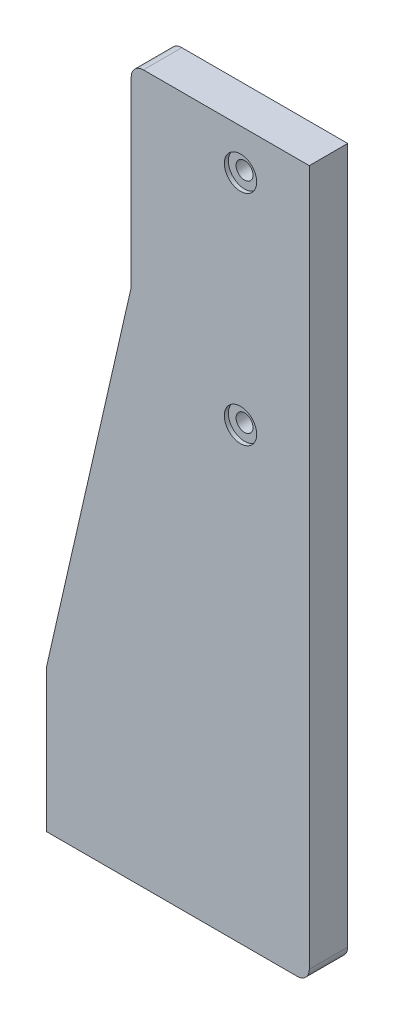
ISO-10303-21;
HEADER;
FILE_DESCRIPTION(('STEP AP214'),'2;1');
FILE_NAME('part.step','',(''),(''),'','','');
FILE_SCHEMA(('AUTOMOTIVE_DESIGN { 1 0 10303 214 1 1 1 1 }'));
ENDSEC;
DATA;
#1=APPLICATION_CONTEXT('core data for automotive mechanical design processes');
#2=APPLICATION_PROTOCOL_DEFINITION('international standard','automotive_design',2000,#1);
#3=PRODUCT_CONTEXT('',#1,'mechanical');
#4=PRODUCT('Part','Part','',(#3));
#5=PRODUCT_RELATED_PRODUCT_CATEGORY('part','',(#4));
#6=PRODUCT_DEFINITION_FORMATION('','',#4);
#7=PRODUCT_DEFINITION_CONTEXT('part definition',#1,'design');
#8=PRODUCT_DEFINITION('design','',#6,#7);
#9=PRODUCT_DEFINITION_SHAPE('','',#8);
#10=(LENGTH_UNIT() NAMED_UNIT(*) SI_UNIT(.MILLI.,.METRE.));
#11=(NAMED_UNIT(*) PLANE_ANGLE_UNIT() SI_UNIT($,.RADIAN.));
#12=(NAMED_UNIT(*) SI_UNIT($,.STERADIAN.) SOLID_ANGLE_UNIT());
#13=UNCERTAINTY_MEASURE_WITH_UNIT(LENGTH_MEASURE(1.E-05),#10,'distance_accuracy_value','');
#14=(GEOMETRIC_REPRESENTATION_CONTEXT(3) GLOBAL_UNCERTAINTY_ASSIGNED_CONTEXT((#13)) GLOBAL_UNIT_ASSIGNED_CONTEXT((#10,
#11,#12)) REPRESENTATION_CONTEXT('',''));
#15=CARTESIAN_POINT('',(0.,0.,0.));
#16=DIRECTION('',(0.,0.,1.));
#17=DIRECTION('',(1.,0.,0.));
#18=AXIS2_PLACEMENT_3D('',#15,#16,#17);
#19=CARTESIAN_POINT('',(48.,111.,0.));
#20=DIRECTION('',(0.,0.,1.));
#21=DIRECTION('',(1.,0.,0.));
#22=AXIS2_PLACEMENT_3D('',#19,#20,#21);
#23=CYLINDRICAL_SURFACE('',#22,2.1);
#24=CARTESIAN_POINT('',(48.,111.,0.));
#25=DIRECTION('',(0.,0.,1.));
#26=DIRECTION('',(1.,0.,0.));
#27=AXIS2_PLACEMENT_3D('',#24,#25,#26);
#28=CIRCLE('',#27,2.1);
#29=CARTESIAN_POINT('',(50.1,111.,0.));
#30=VERTEX_POINT('',#29);
#31=EDGE_CURVE('E142',#30,#30,#28,.T.);
#32=ORIENTED_EDGE('',*,*,#31,.F.);
#33=EDGE_LOOP('',(#32));
#34=FACE_BOUND('',#33,.T.);
#35=CARTESIAN_POINT('',(48.,111.,8.5));
#36=DIRECTION('',(0.,0.,1.));
#37=DIRECTION('',(1.,0.,0.));
#38=AXIS2_PLACEMENT_3D('',#35,#36,#37);
#39=CIRCLE('',#38,2.1);
#40=CARTESIAN_POINT('',(50.1,111.,8.5));
#41=VERTEX_POINT('',#40);
#42=EDGE_CURVE('E161',#41,#41,#39,.F.);
#43=ORIENTED_EDGE('',*,*,#42,.F.);
#44=EDGE_LOOP('',(#43));
#45=FACE_BOUND('',#44,.T.);
#46=ADVANCED_FACE('F35',(#34,#45),#23,.F.);
#47=CARTESIAN_POINT('',(48.,165.,0.));
#48=DIRECTION('',(0.,0.,1.));
#49=DIRECTION('',(1.,0.,0.));
#50=AXIS2_PLACEMENT_3D('',#47,#48,#49);
#51=CYLINDRICAL_SURFACE('',#50,2.1);
#52=CARTESIAN_POINT('',(48.,165.,0.));
#53=DIRECTION('',(0.,0.,1.));
#54=DIRECTION('',(1.,0.,0.));
#55=AXIS2_PLACEMENT_3D('',#52,#53,#54);
#56=CIRCLE('',#55,2.1);
#57=CARTESIAN_POINT('',(50.1,165.,0.));
#58=VERTEX_POINT('',#57);
#59=EDGE_CURVE('E159',#58,#58,#56,.T.);
#60=ORIENTED_EDGE('',*,*,#59,.F.);
#61=EDGE_LOOP('',(#60));
#62=FACE_BOUND('',#61,.T.);
#63=CARTESIAN_POINT('',(48.,165.,8.5));
#64=DIRECTION('',(0.,0.,1.));
#65=DIRECTION('',(1.,0.,0.));
#66=AXIS2_PLACEMENT_3D('',#63,#64,#65);
#67=CIRCLE('',#66,2.1);
#68=CARTESIAN_POINT('',(50.1,165.,8.5));
#69=VERTEX_POINT('',#68);
#70=EDGE_CURVE('E156',#69,#69,#67,.F.);
#71=ORIENTED_EDGE('',*,*,#70,.F.);
#72=EDGE_LOOP('',(#71));
#73=FACE_BOUND('',#72,.T.);
#74=ADVANCED_FACE('F207',(#62,#73),#51,.F.);
#75=CARTESIAN_POINT('',(21.,175.,9.5));
#76=DIRECTION('',(1.,0.,0.));
#77=DIRECTION('',(0.,1.,0.));
#78=AXIS2_PLACEMENT_3D('',#75,#76,#77);
#79=PLANE('',#78);
#80=DIRECTION('',(0.,-1.,0.));
#81=VECTOR('',#80,1.);
#82=CARTESIAN_POINT('',(21.,175.,0.));
#83=LINE('',#82,#81);
#84=CARTESIAN_POINT('',(21.,172.,0.));
#85=VERTEX_POINT('',#84);
#86=CARTESIAN_POINT('',(21.,127.338043935244,0.));
#87=VERTEX_POINT('',#86);
#88=EDGE_CURVE('E139',#85,#87,#83,.T.);
#89=ORIENTED_EDGE('',*,*,#88,.T.);
#90=DIRECTION('',(0.,0.,-1.));
#91=VECTOR('',#90,1.);
#92=CARTESIAN_POINT('',(21.,127.338043935244,9.5));
#93=LINE('',#92,#91);
#94=CARTESIAN_POINT('',(21.,127.338043935244,9.5));
#95=VERTEX_POINT('',#94);
#96=EDGE_CURVE('E183',#87,#95,#93,.F.);
#97=ORIENTED_EDGE('',*,*,#96,.T.);
#98=DIRECTION('',(0.,-1.,0.));
#99=VECTOR('',#98,1.);
#100=CARTESIAN_POINT('',(21.,175.,9.5));
#101=LINE('',#100,#99);
#102=CARTESIAN_POINT('',(21.,172.,9.5));
#103=VERTEX_POINT('',#102);
#104=EDGE_CURVE('E114',#103,#95,#101,.T.);
#105=ORIENTED_EDGE('',*,*,#104,.F.);
#106=DIRECTION('',(0.,0.,-1.));
#107=VECTOR('',#106,1.);
#108=CARTESIAN_POINT('',(21.,172.,9.5));
#109=LINE('',#108,#107);
#110=EDGE_CURVE('E180',#103,#85,#109,.T.);
#111=ORIENTED_EDGE('',*,*,#110,.T.);
#112=EDGE_LOOP('',(#89,#97,#105,#111));
#113=FACE_BOUND('',#112,.T.);
#114=ADVANCED_FACE('F192',(#113),#79,.F.);
#115=CARTESIAN_POINT('',(21.,127.,9.5));
#116=DIRECTION('',(0.974924232936237,-0.222537053170228,0.));
#117=DIRECTION('',(0.222537053170228,0.974924232936238,0.));
#118=AXIS2_PLACEMENT_3D('',#115,#116,#117);
#119=PLANE('',#118);
#120=DIRECTION('',(-0.222537053170228,-0.974924232936238,0.));
#121=VECTOR('',#120,1.);
#122=CARTESIAN_POINT('',(21.,127.,9.5));
#123=LINE('',#122,#121);
#124=CARTESIAN_POINT('',(20.9247726988087,126.670432775733,9.5));
#125=VERTEX_POINT('',#124);
#126=CARTESIAN_POINT('',(0.,35.,9.5));
#127=VERTEX_POINT('',#126);
#128=EDGE_CURVE('E104',#125,#127,#123,.T.);
#129=ORIENTED_EDGE('',*,*,#128,.F.);
#130=DIRECTION('',(0.,0.,-1.));
#131=VECTOR('',#130,1.);
#132=CARTESIAN_POINT('',(20.9247726988087,126.670432775733,0.));
#133=LINE('',#132,#131);
#134=CARTESIAN_POINT('',(20.9247726988087,126.670432775733,0.));
#135=VERTEX_POINT('',#134);
#136=EDGE_CURVE('E178',#125,#135,#133,.T.);
#137=ORIENTED_EDGE('',*,*,#136,.T.);
#138=DIRECTION('',(-0.222537053170228,-0.974924232936238,0.));
#139=VECTOR('',#138,1.);
#140=CARTESIAN_POINT('',(21.,127.,0.));
#141=LINE('',#140,#139);
#142=CARTESIAN_POINT('',(0.,35.,0.));
#143=VERTEX_POINT('',#142);
#144=EDGE_CURVE('E120',#135,#143,#141,.T.);
#145=ORIENTED_EDGE('',*,*,#144,.T.);
#146=DIRECTION('',(0.,0.,-1.));
#147=VECTOR('',#146,1.);
#148=CARTESIAN_POINT('',(0.,35.,9.5));
#149=LINE('',#148,#147);
#150=EDGE_CURVE('E117',#127,#143,#149,.T.);
#151=ORIENTED_EDGE('',*,*,#150,.F.);
#152=EDGE_LOOP('',(#129,#137,#145,#151));
#153=FACE_BOUND('',#152,.T.);
#154=ADVANCED_FACE('F118',(#153),#119,.F.);
#155=CARTESIAN_POINT('',(0.,35.,9.5));
#156=DIRECTION('',(1.,0.,0.));
#157=DIRECTION('',(0.,1.,0.));
#158=AXIS2_PLACEMENT_3D('',#155,#156,#157);
#159=PLANE('',#158);
#160=DIRECTION('',(0.,-1.,0.));
#161=VECTOR('',#160,1.);
#162=CARTESIAN_POINT('',(0.,35.,0.));
#163=LINE('',#162,#161);
#164=CARTESIAN_POINT('',(0.,0.,0.));
#165=VERTEX_POINT('',#164);
#166=EDGE_CURVE('E144',#143,#165,#163,.T.);
#167=ORIENTED_EDGE('',*,*,#166,.T.);
#168=DIRECTION('',(0.,0.,-1.));
#169=VECTOR('',#168,1.);
#170=CARTESIAN_POINT('',(0.,0.,9.5));
#171=LINE('',#170,#169);
#172=CARTESIAN_POINT('',(0.,0.,9.5));
#173=VERTEX_POINT('',#172);
#174=EDGE_CURVE('E124',#173,#165,#171,.T.);
#175=ORIENTED_EDGE('',*,*,#174,.F.);
#176=DIRECTION('',(0.,-1.,0.));
#177=VECTOR('',#176,1.);
#178=CARTESIAN_POINT('',(0.,35.,9.5));
#179=LINE('',#178,#177);
#180=EDGE_CURVE('E109',#127,#173,#179,.T.);
#181=ORIENTED_EDGE('',*,*,#180,.F.);
#182=ORIENTED_EDGE('',*,*,#150,.T.);
#183=EDGE_LOOP('',(#167,#175,#181,#182));
#184=FACE_BOUND('',#183,.T.);
#185=ADVANCED_FACE('F126',(#184),#159,.F.);
#186=CARTESIAN_POINT('',(0.,0.,9.5));
#187=DIRECTION('',(0.,1.,0.));
#188=DIRECTION('',(0.,0.,1.));
#189=AXIS2_PLACEMENT_3D('',#186,#187,#188);
#190=PLANE('',#189);
#191=DIRECTION('',(1.,0.,0.));
#192=VECTOR('',#191,1.);
#193=CARTESIAN_POINT('',(0.,0.,0.));
#194=LINE('',#193,#192);
#195=CARTESIAN_POINT('',(62.,0.,0.));
#196=VERTEX_POINT('',#195);
#197=EDGE_CURVE('E146',#165,#196,#194,.T.);
#198=ORIENTED_EDGE('',*,*,#197,.T.);
#199=DIRECTION('',(0.,0.,-1.));
#200=VECTOR('',#199,1.);
#201=CARTESIAN_POINT('',(62.,0.,9.5));
#202=LINE('',#201,#200);
#203=CARTESIAN_POINT('',(62.,0.,9.5));
#204=VERTEX_POINT('',#203);
#205=EDGE_CURVE('E172',#196,#204,#202,.F.);
#206=ORIENTED_EDGE('',*,*,#205,.T.);
#207=DIRECTION('',(1.,0.,0.));
#208=VECTOR('',#207,1.);
#209=CARTESIAN_POINT('',(0.,0.,9.5));
#210=LINE('',#209,#208);
#211=EDGE_CURVE('E129',#173,#204,#210,.T.);
#212=ORIENTED_EDGE('',*,*,#211,.F.);
#213=ORIENTED_EDGE('',*,*,#174,.T.);
#214=EDGE_LOOP('',(#198,#206,#212,#213));
#215=FACE_BOUND('',#214,.T.);
#216=ADVANCED_FACE('F232',(#215),#190,.F.);
#217=CARTESIAN_POINT('',(65.,0.,9.5));
#218=DIRECTION('',(-1.,0.,0.));
#219=DIRECTION('',(0.,0.,1.));
#220=AXIS2_PLACEMENT_3D('',#217,#218,#219);
#221=PLANE('',#220);
#222=DIRECTION('',(0.,1.,0.));
#223=VECTOR('',#222,1.);
#224=CARTESIAN_POINT('',(65.,0.,9.5));
#225=LINE('',#224,#223);
#226=CARTESIAN_POINT('',(65.,3.,9.5));
#227=VERTEX_POINT('',#226);
#228=CARTESIAN_POINT('',(65.,175.,9.5));
#229=VERTEX_POINT('',#228);
#230=EDGE_CURVE('E131',#227,#229,#225,.T.);
#231=ORIENTED_EDGE('',*,*,#230,.F.);
#232=DIRECTION('',(0.,0.,-1.));
#233=VECTOR('',#232,1.);
#234=CARTESIAN_POINT('',(65.,3.,9.5));
#235=LINE('',#234,#233);
#236=CARTESIAN_POINT('',(65.,3.,0.));
#237=VERTEX_POINT('',#236);
#238=EDGE_CURVE('E123',#227,#237,#235,.T.);
#239=ORIENTED_EDGE('',*,*,#238,.T.);
#240=DIRECTION('',(0.,1.,0.));
#241=VECTOR('',#240,1.);
#242=CARTESIAN_POINT('',(65.,0.,0.));
#243=LINE('',#242,#241);
#244=CARTESIAN_POINT('',(65.,175.,0.));
#245=VERTEX_POINT('',#244);
#246=EDGE_CURVE('E149',#237,#245,#243,.T.);
#247=ORIENTED_EDGE('',*,*,#246,.T.);
#248=DIRECTION('',(0.,0.,-1.));
#249=VECTOR('',#248,1.);
#250=CARTESIAN_POINT('',(65.,175.,9.5));
#251=LINE('',#250,#249);
#252=EDGE_CURVE('E138',#229,#245,#251,.T.);
#253=ORIENTED_EDGE('',*,*,#252,.F.);
#254=EDGE_LOOP('',(#231,#239,#247,#253));
#255=FACE_BOUND('',#254,.T.);
#256=ADVANCED_FACE('F229',(#255),#221,.F.);
#257=CARTESIAN_POINT('',(65.,175.,9.5));
#258=DIRECTION('',(0.,-1.,0.));
#259=DIRECTION('',(0.,0.,-1.));
#260=AXIS2_PLACEMENT_3D('',#257,#258,#259);
#261=PLANE('',#260);
#262=DIRECTION('',(-1.,0.,0.));
#263=VECTOR('',#262,1.);
#264=CARTESIAN_POINT('',(65.,175.,0.));
#265=LINE('',#264,#263);
#266=CARTESIAN_POINT('',(24.,175.,0.));
#267=VERTEX_POINT('',#266);
#268=EDGE_CURVE('E151',#245,#267,#265,.T.);
#269=ORIENTED_EDGE('',*,*,#268,.T.);
#270=DIRECTION('',(0.,0.,-1.));
#271=VECTOR('',#270,1.);
#272=CARTESIAN_POINT('',(24.,175.,9.5));
#273=LINE('',#272,#271);
#274=CARTESIAN_POINT('',(24.,175.,9.5));
#275=VERTEX_POINT('',#274);
#276=EDGE_CURVE('E50',#267,#275,#273,.F.);
#277=ORIENTED_EDGE('',*,*,#276,.T.);
#278=DIRECTION('',(-1.,0.,0.));
#279=VECTOR('',#278,1.);
#280=CARTESIAN_POINT('',(65.,175.,9.5));
#281=LINE('',#280,#279);
#282=EDGE_CURVE('E136',#229,#275,#281,.T.);
#283=ORIENTED_EDGE('',*,*,#282,.F.);
#284=ORIENTED_EDGE('',*,*,#252,.T.);
#285=EDGE_LOOP('',(#269,#277,#283,#284));
#286=FACE_BOUND('',#285,.T.);
#287=ADVANCED_FACE('F221',(#286),#261,.F.);
#288=CARTESIAN_POINT('',(0.,0.,9.5));
#289=DIRECTION('',(0.,0.,1.));
#290=DIRECTION('',(1.,0.,0.));
#291=AXIS2_PLACEMENT_3D('',#288,#289,#290);
#292=PLANE('',#291);
#293=CARTESIAN_POINT('',(48.,111.,9.5));
#294=DIRECTION('',(0.,0.,1.));
#295=DIRECTION('',(1.,0.,0.));
#296=AXIS2_PLACEMENT_3D('',#293,#294,#295);
#297=CIRCLE('',#296,4.00000000000001);
#298=CARTESIAN_POINT('',(52.,111.,9.5));
#299=VERTEX_POINT('',#298);
#300=EDGE_CURVE('E358',#299,#299,#297,.T.);
#301=ORIENTED_EDGE('',*,*,#300,.F.);
#302=EDGE_LOOP('',(#301));
#303=FACE_BOUND('',#302,.T.);
#304=CARTESIAN_POINT('',(48.,165.,9.5));
#305=DIRECTION('',(0.,0.,1.));
#306=DIRECTION('',(1.,0.,0.));
#307=AXIS2_PLACEMENT_3D('',#304,#305,#306);
#308=CIRCLE('',#307,4.00000000000001);
#309=CARTESIAN_POINT('',(52.,165.,9.5));
#310=VERTEX_POINT('',#309);
#311=EDGE_CURVE('E164',#310,#310,#308,.T.);
#312=ORIENTED_EDGE('',*,*,#311,.F.);
#313=EDGE_LOOP('',(#312));
#314=FACE_BOUND('',#313,.T.);
#315=ORIENTED_EDGE('',*,*,#211,.T.);
#316=CARTESIAN_POINT('',(62.,3.,9.5));
#317=DIRECTION('',(0.,0.,1.));
#318=DIRECTION('',(1.,0.,0.));
#319=AXIS2_PLACEMENT_3D('',#316,#317,#318);
#320=CIRCLE('',#319,3.);
#321=EDGE_CURVE('E176',#204,#227,#320,.T.);
#322=ORIENTED_EDGE('',*,*,#321,.T.);
#323=ORIENTED_EDGE('',*,*,#230,.T.);
#324=ORIENTED_EDGE('',*,*,#282,.T.);
#325=CARTESIAN_POINT('',(24.,172.,9.5));
#326=DIRECTION('',(0.,0.,1.));
#327=DIRECTION('',(1.,0.,0.));
#328=AXIS2_PLACEMENT_3D('',#325,#326,#327);
#329=CIRCLE('',#328,3.);
#330=EDGE_CURVE('E174',#275,#103,#329,.T.);
#331=ORIENTED_EDGE('',*,*,#330,.T.);
#332=ORIENTED_EDGE('',*,*,#104,.T.);
#333=CARTESIAN_POINT('',(18.,127.338043935244,9.5));
#334=DIRECTION('',(0.,0.,1.));
#335=DIRECTION('',(1.,0.,0.));
#336=AXIS2_PLACEMENT_3D('',#333,#334,#335);
#337=CIRCLE('',#336,3.);
#338=EDGE_CURVE('E11',#95,#125,#337,.F.);
#339=ORIENTED_EDGE('',*,*,#338,.T.);
#340=ORIENTED_EDGE('',*,*,#128,.T.);
#341=ORIENTED_EDGE('',*,*,#180,.T.);
#342=EDGE_LOOP('',(#315,#322,#323,#324,#331,#332,#339,#340,#341));
#343=FACE_BOUND('',#342,.T.);
#344=ADVANCED_FACE('F107',(#303,#314,#343),#292,.T.);
#345=CARTESIAN_POINT('',(0.,0.,0.));
#346=DIRECTION('',(0.,0.,1.));
#347=DIRECTION('',(1.,0.,0.));
#348=AXIS2_PLACEMENT_3D('',#345,#346,#347);
#349=PLANE('',#348);
#350=ORIENTED_EDGE('',*,*,#59,.T.);
#351=EDGE_LOOP('',(#350));
#352=FACE_BOUND('',#351,.T.);
#353=ORIENTED_EDGE('',*,*,#31,.T.);
#354=EDGE_LOOP('',(#353));
#355=FACE_BOUND('',#354,.T.);
#356=ORIENTED_EDGE('',*,*,#246,.F.);
#357=CARTESIAN_POINT('',(62.,3.,0.));
#358=DIRECTION('',(0.,0.,1.));
#359=DIRECTION('',(1.,0.,0.));
#360=AXIS2_PLACEMENT_3D('',#357,#358,#359);
#361=CIRCLE('',#360,3.);
#362=EDGE_CURVE('E170',#237,#196,#361,.F.);
#363=ORIENTED_EDGE('',*,*,#362,.T.);
#364=ORIENTED_EDGE('',*,*,#197,.F.);
#365=ORIENTED_EDGE('',*,*,#166,.F.);
#366=ORIENTED_EDGE('',*,*,#144,.F.);
#367=CARTESIAN_POINT('',(18.,127.338043935244,0.));
#368=DIRECTION('',(0.,0.,1.));
#369=DIRECTION('',(1.,0.,0.));
#370=AXIS2_PLACEMENT_3D('',#367,#368,#369);
#371=CIRCLE('',#370,3.);
#372=EDGE_CURVE('E43',#135,#87,#371,.T.);
#373=ORIENTED_EDGE('',*,*,#372,.T.);
#374=ORIENTED_EDGE('',*,*,#88,.F.);
#375=CARTESIAN_POINT('',(24.,172.,0.));
#376=DIRECTION('',(0.,0.,1.));
#377=DIRECTION('',(1.,0.,0.));
#378=AXIS2_PLACEMENT_3D('',#375,#376,#377);
#379=CIRCLE('',#378,3.);
#380=EDGE_CURVE('E168',#85,#267,#379,.F.);
#381=ORIENTED_EDGE('',*,*,#380,.T.);
#382=ORIENTED_EDGE('',*,*,#268,.F.);
#383=EDGE_LOOP('',(#356,#363,#364,#365,#366,#373,#374,#381,#382));
#384=FACE_BOUND('',#383,.T.);
#385=ADVANCED_FACE('F188',(#352,#355,#384),#349,.F.);
#386=CARTESIAN_POINT('',(48.,165.,8.5));
#387=DIRECTION('',(0.,0.,1.));
#388=DIRECTION('',(1.,0.,0.));
#389=AXIS2_PLACEMENT_3D('',#386,#387,#388);
#390=PLANE('',#389);
#391=CARTESIAN_POINT('',(48.,165.,8.5));
#392=DIRECTION('',(0.,0.,1.));
#393=DIRECTION('',(1.,0.,0.));
#394=AXIS2_PLACEMENT_3D('',#391,#392,#393);
#395=CIRCLE('',#394,4.00000000000001);
#396=CARTESIAN_POINT('',(52.,165.,8.5));
#397=VERTEX_POINT('',#396);
#398=EDGE_CURVE('E160',#397,#397,#395,.T.);
#399=ORIENTED_EDGE('',*,*,#398,.T.);
#400=EDGE_LOOP('',(#399));
#401=FACE_BOUND('',#400,.T.);
#402=ORIENTED_EDGE('',*,*,#70,.T.);
#403=EDGE_LOOP('',(#402));
#404=FACE_BOUND('',#403,.T.);
#405=ADVANCED_FACE('F225',(#401,#404),#390,.T.);
#406=CARTESIAN_POINT('',(48.,165.,8.5));
#407=DIRECTION('',(0.,0.,1.));
#408=DIRECTION('',(1.,0.,0.));
#409=AXIS2_PLACEMENT_3D('',#406,#407,#408);
#410=CYLINDRICAL_SURFACE('',#409,4.00000000000001);
#411=ORIENTED_EDGE('',*,*,#398,.F.);
#412=EDGE_LOOP('',(#411));
#413=FACE_BOUND('',#412,.T.);
#414=ORIENTED_EDGE('',*,*,#311,.T.);
#415=EDGE_LOOP('',(#414));
#416=FACE_BOUND('',#415,.T.);
#417=ADVANCED_FACE('F282',(#413,#416),#410,.F.);
#418=CARTESIAN_POINT('',(48.,111.,8.5));
#419=DIRECTION('',(0.,0.,1.));
#420=DIRECTION('',(1.,0.,0.));
#421=AXIS2_PLACEMENT_3D('',#418,#419,#420);
#422=PLANE('',#421);
#423=CARTESIAN_POINT('',(48.,111.,8.5));
#424=DIRECTION('',(0.,0.,1.));
#425=DIRECTION('',(1.,0.,0.));
#426=AXIS2_PLACEMENT_3D('',#423,#424,#425);
#427=CIRCLE('',#426,4.00000000000001);
#428=CARTESIAN_POINT('',(52.,111.,8.5));
#429=VERTEX_POINT('',#428);
#430=EDGE_CURVE('E165',#429,#429,#427,.T.);
#431=ORIENTED_EDGE('',*,*,#430,.T.);
#432=EDGE_LOOP('',(#431));
#433=FACE_BOUND('',#432,.T.);
#434=ORIENTED_EDGE('',*,*,#42,.T.);
#435=EDGE_LOOP('',(#434));
#436=FACE_BOUND('',#435,.T.);
#437=ADVANCED_FACE('F290',(#433,#436),#422,.T.);
#438=CARTESIAN_POINT('',(48.,111.,8.5));
#439=DIRECTION('',(0.,0.,1.));
#440=DIRECTION('',(1.,0.,0.));
#441=AXIS2_PLACEMENT_3D('',#438,#439,#440);
#442=CYLINDRICAL_SURFACE('',#441,4.00000000000001);
#443=ORIENTED_EDGE('',*,*,#430,.F.);
#444=EDGE_LOOP('',(#443));
#445=FACE_BOUND('',#444,.T.);
#446=ORIENTED_EDGE('',*,*,#300,.T.);
#447=EDGE_LOOP('',(#446));
#448=FACE_BOUND('',#447,.T.);
#449=ADVANCED_FACE('F203',(#445,#448),#442,.F.);
#450=CARTESIAN_POINT('',(62.,3.,9.5));
#451=DIRECTION('',(0.,0.,-1.));
#452=DIRECTION('',(-1.,0.,0.));
#453=AXIS2_PLACEMENT_3D('',#450,#451,#452);
#454=CYLINDRICAL_SURFACE('',#453,3.);
#455=ORIENTED_EDGE('',*,*,#321,.F.);
#456=ORIENTED_EDGE('',*,*,#205,.F.);
#457=ORIENTED_EDGE('',*,*,#362,.F.);
#458=ORIENTED_EDGE('',*,*,#238,.F.);
#459=EDGE_LOOP('',(#455,#456,#457,#458));
#460=FACE_BOUND('',#459,.T.);
#461=ADVANCED_FACE('F197',(#460),#454,.T.);
#462=CARTESIAN_POINT('',(18.,127.338043935244,9.5));
#463=DIRECTION('',(0.,0.,1.));
#464=DIRECTION('',(1.,0.,0.));
#465=AXIS2_PLACEMENT_3D('',#462,#463,#464);
#466=CYLINDRICAL_SURFACE('',#465,3.);
#467=ORIENTED_EDGE('',*,*,#338,.F.);
#468=ORIENTED_EDGE('',*,*,#96,.F.);
#469=ORIENTED_EDGE('',*,*,#372,.F.);
#470=ORIENTED_EDGE('',*,*,#136,.F.);
#471=EDGE_LOOP('',(#467,#468,#469,#470));
#472=FACE_BOUND('',#471,.T.);
#473=ADVANCED_FACE('F195',(#472),#466,.F.);
#474=CARTESIAN_POINT('',(24.,172.,9.5));
#475=DIRECTION('',(0.,0.,-1.));
#476=DIRECTION('',(-1.,0.,0.));
#477=AXIS2_PLACEMENT_3D('',#474,#475,#476);
#478=CYLINDRICAL_SURFACE('',#477,3.);
#479=ORIENTED_EDGE('',*,*,#330,.F.);
#480=ORIENTED_EDGE('',*,*,#276,.F.);
#481=ORIENTED_EDGE('',*,*,#380,.F.);
#482=ORIENTED_EDGE('',*,*,#110,.F.);
#483=EDGE_LOOP('',(#479,#480,#481,#482));
#484=FACE_BOUND('',#483,.T.);
#485=ADVANCED_FACE('F37',(#484),#478,.T.);
#486=CLOSED_SHELL('',(#46,#74,#114,#154,#185,#216,#256,#287,#344,#385,#405,#417,#437,#449,#461,
#473,#485));
#487=MANIFOLD_SOLID_BREP('B2',#486);
#488=ADVANCED_BREP_SHAPE_REPRESENTATION('',(#18,#487),#14);
#489=SHAPE_DEFINITION_REPRESENTATION(#9,#488);
ENDSEC;
END-ISO-10303-21;
